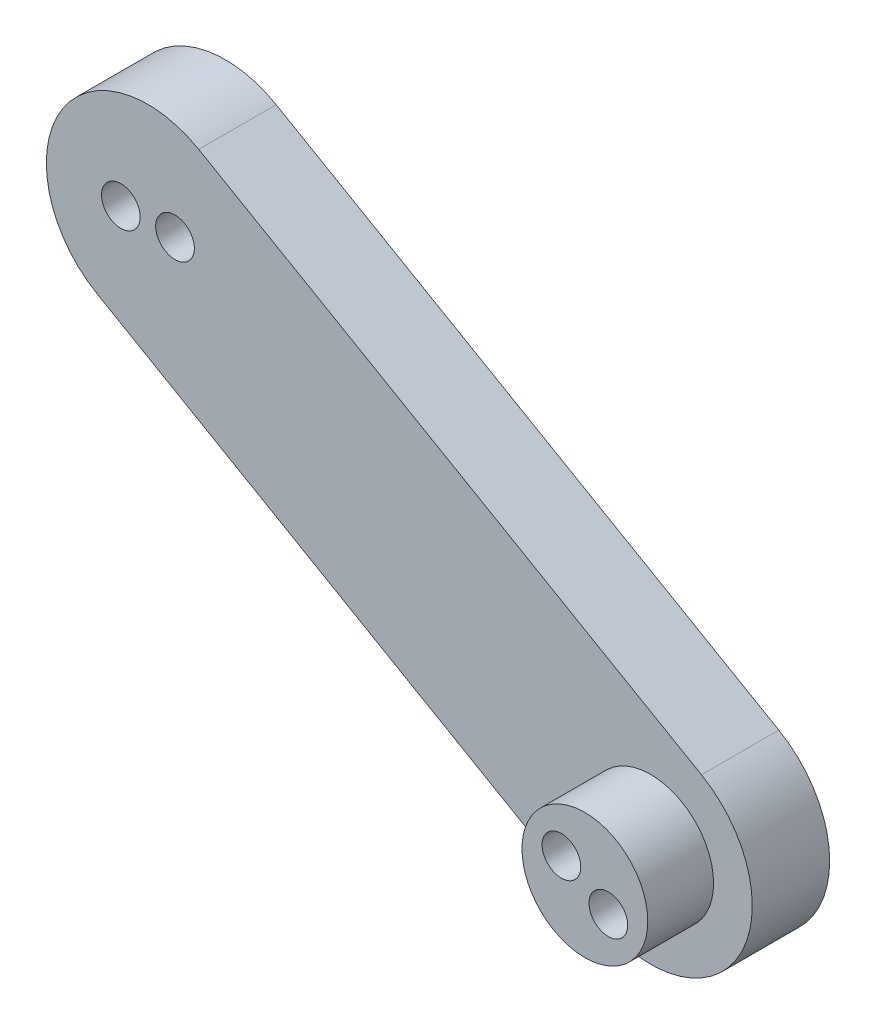
ISO-10303-21;
HEADER;
FILE_DESCRIPTION(('STEP AP214'),'2;1');
FILE_NAME('part.step','',(''),(''),'','','');
FILE_SCHEMA(('AUTOMOTIVE_DESIGN { 1 0 10303 214 1 1 1 1 }'));
ENDSEC;
DATA;
#1=APPLICATION_CONTEXT('core data for automotive mechanical design processes');
#2=APPLICATION_PROTOCOL_DEFINITION('international standard','automotive_design',2000,#1);
#3=PRODUCT_CONTEXT('',#1,'mechanical');
#4=PRODUCT('Part','Part','',(#3));
#5=PRODUCT_RELATED_PRODUCT_CATEGORY('part','',(#4));
#6=PRODUCT_DEFINITION_FORMATION('','',#4);
#7=PRODUCT_DEFINITION_CONTEXT('part definition',#1,'design');
#8=PRODUCT_DEFINITION('design','',#6,#7);
#9=PRODUCT_DEFINITION_SHAPE('','',#8);
#10=(LENGTH_UNIT() NAMED_UNIT(*) SI_UNIT(.MILLI.,.METRE.));
#11=(NAMED_UNIT(*) PLANE_ANGLE_UNIT() SI_UNIT($,.RADIAN.));
#12=(NAMED_UNIT(*) SI_UNIT($,.STERADIAN.) SOLID_ANGLE_UNIT());
#13=UNCERTAINTY_MEASURE_WITH_UNIT(LENGTH_MEASURE(1.E-05),#10,'distance_accuracy_value','');
#14=(GEOMETRIC_REPRESENTATION_CONTEXT(3) GLOBAL_UNCERTAINTY_ASSIGNED_CONTEXT((#13)) GLOBAL_UNIT_ASSIGNED_CONTEXT((#10,
#11,#12)) REPRESENTATION_CONTEXT('',''));
#15=CARTESIAN_POINT('',(0.,0.,0.));
#16=DIRECTION('',(0.,0.,1.));
#17=DIRECTION('',(1.,0.,0.));
#18=AXIS2_PLACEMENT_3D('',#15,#16,#17);
#19=CARTESIAN_POINT('',(-2.62499999999997,-4.54663336986832,-4.));
#20=DIRECTION('',(0.499999999999995,0.866025403784442,0.));
#21=DIRECTION('',(-0.866025403784442,0.499999999999995,0.));
#22=AXIS2_PLACEMENT_3D('',#19,#20,#21);
#23=PLANE('',#22);
#24=DIRECTION('',(-0.866025403784442,0.499999999999995,0.));
#25=VECTOR('',#24,1.);
#26=CARTESIAN_POINT('',(-2.62499999999997,-4.54663336986832,0.));
#27=LINE('',#26,#25);
#28=CARTESIAN_POINT('',(23.3557621135333,-19.5466333698682,0.));
#29=VERTEX_POINT('',#28);
#30=CARTESIAN_POINT('',(-2.62499999999997,-4.54663336986832,0.));
#31=VERTEX_POINT('',#30);
#32=EDGE_CURVE('E124',#29,#31,#27,.T.);
#33=ORIENTED_EDGE('',*,*,#32,.T.);
#34=DIRECTION('',(0.,0.,1.));
#35=VECTOR('',#34,1.);
#36=CARTESIAN_POINT('',(-2.62499999999997,-4.54663336986832,-4.));
#37=LINE('',#36,#35);
#38=CARTESIAN_POINT('',(-2.62499999999997,-4.54663336986832,-4.));
#39=VERTEX_POINT('',#38);
#40=EDGE_CURVE('E11',#39,#31,#37,.T.);
#41=ORIENTED_EDGE('',*,*,#40,.F.);
#42=DIRECTION('',(-0.866025403784442,0.499999999999995,0.));
#43=VECTOR('',#42,1.);
#44=CARTESIAN_POINT('',(-2.62499999999997,-4.54663336986832,-4.));
#45=LINE('',#44,#43);
#46=CARTESIAN_POINT('',(23.3557621135333,-19.5466333698682,-4.));
#47=VERTEX_POINT('',#46);
#48=EDGE_CURVE('E64',#47,#39,#45,.T.);
#49=ORIENTED_EDGE('',*,*,#48,.F.);
#50=DIRECTION('',(0.,0.,1.));
#51=VECTOR('',#50,1.);
#52=CARTESIAN_POINT('',(23.3557621135333,-19.5466333698682,-4.));
#53=LINE('',#52,#51);
#54=EDGE_CURVE('E49',#47,#29,#53,.T.);
#55=ORIENTED_EDGE('',*,*,#54,.T.);
#56=EDGE_LOOP('',(#33,#41,#49,#55));
#57=FACE_BOUND('',#56,.T.);
#58=ADVANCED_FACE('F45',(#57),#23,.F.);
#59=CARTESIAN_POINT('',(0.,0.,-4.));
#60=DIRECTION('',(0.,0.,1.));
#61=DIRECTION('',(1.,0.,0.));
#62=AXIS2_PLACEMENT_3D('',#59,#60,#61);
#63=CYLINDRICAL_SURFACE('',#62,5.25);
#64=CARTESIAN_POINT('',(0.,0.,0.));
#65=DIRECTION('',(0.,0.,1.));
#66=DIRECTION('',(1.,0.,0.));
#67=AXIS2_PLACEMENT_3D('',#64,#65,#66);
#68=CIRCLE('',#67,5.25);
#69=CARTESIAN_POINT('',(2.62499999999997,4.54663336986832,0.));
#70=VERTEX_POINT('',#69);
#71=EDGE_CURVE('E129',#70,#31,#68,.T.);
#72=ORIENTED_EDGE('',*,*,#71,.F.);
#73=DIRECTION('',(0.,0.,1.));
#74=VECTOR('',#73,1.);
#75=CARTESIAN_POINT('',(2.62499999999997,4.54663336986832,-4.));
#76=LINE('',#75,#74);
#77=CARTESIAN_POINT('',(2.62499999999997,4.54663336986832,-4.));
#78=VERTEX_POINT('',#77);
#79=EDGE_CURVE('E55',#78,#70,#76,.T.);
#80=ORIENTED_EDGE('',*,*,#79,.F.);
#81=CARTESIAN_POINT('',(0.,0.,-4.));
#82=DIRECTION('',(0.,0.,1.));
#83=DIRECTION('',(1.,0.,0.));
#84=AXIS2_PLACEMENT_3D('',#81,#82,#83);
#85=CIRCLE('',#84,5.25);
#86=EDGE_CURVE('E98',#78,#39,#85,.T.);
#87=ORIENTED_EDGE('',*,*,#86,.T.);
#88=ORIENTED_EDGE('',*,*,#40,.T.);
#89=EDGE_LOOP('',(#72,#80,#87,#88));
#90=FACE_BOUND('',#89,.T.);
#91=ADVANCED_FACE('F177',(#90),#63,.T.);
#92=CARTESIAN_POINT('',(2.62499999999997,4.54663336986832,-4.));
#93=DIRECTION('',(-0.499999999999995,-0.866025403784442,0.));
#94=DIRECTION('',(0.866025403784442,-0.499999999999995,0.));
#95=AXIS2_PLACEMENT_3D('',#92,#93,#94);
#96=PLANE('',#95);
#97=DIRECTION('',(0.866025403784442,-0.499999999999995,0.));
#98=VECTOR('',#97,1.);
#99=CARTESIAN_POINT('',(2.62499999999997,4.54663336986832,0.));
#100=LINE('',#99,#98);
#101=CARTESIAN_POINT('',(28.6057621135332,-10.4533666301315,0.));
#102=VERTEX_POINT('',#101);
#103=EDGE_CURVE('E102',#70,#102,#100,.T.);
#104=ORIENTED_EDGE('',*,*,#103,.T.);
#105=DIRECTION('',(0.,0.,1.));
#106=VECTOR('',#105,1.);
#107=CARTESIAN_POINT('',(28.6057621135332,-10.4533666301315,-4.));
#108=LINE('',#107,#106);
#109=CARTESIAN_POINT('',(28.6057621135332,-10.4533666301315,-4.));
#110=VERTEX_POINT('',#109);
#111=EDGE_CURVE('E100',#110,#102,#108,.T.);
#112=ORIENTED_EDGE('',*,*,#111,.F.);
#113=DIRECTION('',(0.866025403784442,-0.499999999999995,0.));
#114=VECTOR('',#113,1.);
#115=CARTESIAN_POINT('',(2.62499999999997,4.54663336986832,-4.));
#116=LINE('',#115,#114);
#117=EDGE_CURVE('E93',#78,#110,#116,.T.);
#118=ORIENTED_EDGE('',*,*,#117,.F.);
#119=ORIENTED_EDGE('',*,*,#79,.T.);
#120=EDGE_LOOP('',(#104,#112,#118,#119));
#121=FACE_BOUND('',#120,.T.);
#122=ADVANCED_FACE('F101',(#121),#96,.F.);
#123=CARTESIAN_POINT('',(24.768326548235,-14.2999999999998,-4.));
#124=DIRECTION('',(0.,0.,1.));
#125=DIRECTION('',(1.,0.,0.));
#126=AXIS2_PLACEMENT_3D('',#123,#124,#125);
#127=CYLINDRICAL_SURFACE('',#126,0.999999999999992);
#128=CARTESIAN_POINT('',(24.768326548235,-14.2999999999998,-4.));
#129=DIRECTION('',(0.,0.,1.));
#130=DIRECTION('',(1.,0.,0.));
#131=AXIS2_PLACEMENT_3D('',#128,#129,#130);
#132=CIRCLE('',#131,0.999999999999992);
#133=CARTESIAN_POINT('',(25.768326548235,-14.2999999999998,-4.));
#134=VERTEX_POINT('',#133);
#135=EDGE_CURVE('E111',#134,#134,#132,.T.);
#136=ORIENTED_EDGE('',*,*,#135,.F.);
#137=EDGE_LOOP('',(#136));
#138=FACE_BOUND('',#137,.T.);
#139=CARTESIAN_POINT('',(24.768326548235,-14.2999999999998,3.4));
#140=DIRECTION('',(0.,0.,1.));
#141=DIRECTION('',(1.,0.,0.));
#142=AXIS2_PLACEMENT_3D('',#139,#140,#141);
#143=CIRCLE('',#142,0.999999999999992);
#144=CARTESIAN_POINT('',(25.768326548235,-14.2999999999998,3.4));
#145=VERTEX_POINT('',#144);
#146=EDGE_CURVE('E144',#145,#145,#143,.T.);
#147=ORIENTED_EDGE('',*,*,#146,.T.);
#148=EDGE_LOOP('',(#147));
#149=FACE_BOUND('',#148,.T.);
#150=ADVANCED_FACE('F153',(#138,#149),#127,.F.);
#151=CARTESIAN_POINT('',(25.9807621135332,-14.9999999999998,-4.));
#152=DIRECTION('',(0.,0.,1.));
#153=DIRECTION('',(1.,0.,0.));
#154=AXIS2_PLACEMENT_3D('',#151,#152,#153);
#155=CYLINDRICAL_SURFACE('',#154,5.25);
#156=CARTESIAN_POINT('',(25.9807621135332,-14.9999999999998,0.));
#157=DIRECTION('',(0.,0.,1.));
#158=DIRECTION('',(1.,0.,0.));
#159=AXIS2_PLACEMENT_3D('',#156,#157,#158);
#160=CIRCLE('',#159,5.25);
#161=EDGE_CURVE('E126',#29,#102,#160,.T.);
#162=ORIENTED_EDGE('',*,*,#161,.F.);
#163=ORIENTED_EDGE('',*,*,#54,.F.);
#164=CARTESIAN_POINT('',(25.9807621135332,-14.9999999999998,-4.));
#165=DIRECTION('',(0.,0.,1.));
#166=DIRECTION('',(1.,0.,0.));
#167=AXIS2_PLACEMENT_3D('',#164,#165,#166);
#168=CIRCLE('',#167,5.25);
#169=EDGE_CURVE('E97',#47,#110,#168,.T.);
#170=ORIENTED_EDGE('',*,*,#169,.T.);
#171=ORIENTED_EDGE('',*,*,#111,.T.);
#172=EDGE_LOOP('',(#162,#163,#170,#171));
#173=FACE_BOUND('',#172,.T.);
#174=ADVANCED_FACE('F104',(#173),#155,.T.);
#175=CARTESIAN_POINT('',(1.40000000000002,0.,-4.));
#176=DIRECTION('',(0.,0.,1.));
#177=DIRECTION('',(1.,0.,0.));
#178=AXIS2_PLACEMENT_3D('',#175,#176,#177);
#179=CYLINDRICAL_SURFACE('',#178,1.);
#180=CARTESIAN_POINT('',(1.40000000000002,0.,-4.));
#181=DIRECTION('',(0.,0.,1.));
#182=DIRECTION('',(1.,0.,0.));
#183=AXIS2_PLACEMENT_3D('',#180,#181,#182);
#184=CIRCLE('',#183,1.);
#185=CARTESIAN_POINT('',(2.40000000000002,0.,-4.));
#186=VERTEX_POINT('',#185);
#187=EDGE_CURVE('E106',#186,#186,#184,.T.);
#188=ORIENTED_EDGE('',*,*,#187,.F.);
#189=EDGE_LOOP('',(#188));
#190=FACE_BOUND('',#189,.T.);
#191=CARTESIAN_POINT('',(1.40000000000002,0.,0.));
#192=DIRECTION('',(0.,0.,1.));
#193=DIRECTION('',(1.,0.,0.));
#194=AXIS2_PLACEMENT_3D('',#191,#192,#193);
#195=CIRCLE('',#194,1.);
#196=CARTESIAN_POINT('',(2.40000000000002,0.,0.));
#197=VERTEX_POINT('',#196);
#198=EDGE_CURVE('E120',#197,#197,#195,.T.);
#199=ORIENTED_EDGE('',*,*,#198,.T.);
#200=EDGE_LOOP('',(#199));
#201=FACE_BOUND('',#200,.T.);
#202=ADVANCED_FACE('F190',(#190,#201),#179,.F.);
#203=CARTESIAN_POINT('',(-1.39999999999996,0.,-4.));
#204=DIRECTION('',(0.,0.,1.));
#205=DIRECTION('',(1.,0.,0.));
#206=AXIS2_PLACEMENT_3D('',#203,#204,#205);
#207=CYLINDRICAL_SURFACE('',#206,1.);
#208=CARTESIAN_POINT('',(-1.39999999999996,0.,-4.));
#209=DIRECTION('',(0.,0.,1.));
#210=DIRECTION('',(1.,0.,0.));
#211=AXIS2_PLACEMENT_3D('',#208,#209,#210);
#212=CIRCLE('',#211,1.);
#213=CARTESIAN_POINT('',(-0.39999999999996,0.,-4.));
#214=VERTEX_POINT('',#213);
#215=EDGE_CURVE('E131',#214,#214,#212,.T.);
#216=ORIENTED_EDGE('',*,*,#215,.F.);
#217=EDGE_LOOP('',(#216));
#218=FACE_BOUND('',#217,.T.);
#219=CARTESIAN_POINT('',(-1.39999999999996,0.,0.));
#220=DIRECTION('',(0.,0.,1.));
#221=DIRECTION('',(1.,0.,0.));
#222=AXIS2_PLACEMENT_3D('',#219,#220,#221);
#223=CIRCLE('',#222,1.);
#224=CARTESIAN_POINT('',(-0.39999999999996,0.,0.));
#225=VERTEX_POINT('',#224);
#226=EDGE_CURVE('E117',#225,#225,#223,.T.);
#227=ORIENTED_EDGE('',*,*,#226,.T.);
#228=EDGE_LOOP('',(#227));
#229=FACE_BOUND('',#228,.T.);
#230=ADVANCED_FACE('F47',(#218,#229),#207,.F.);
#231=CARTESIAN_POINT('',(27.1931976788315,-15.6999999999998,-4.));
#232=DIRECTION('',(0.,0.,1.));
#233=DIRECTION('',(1.,0.,0.));
#234=AXIS2_PLACEMENT_3D('',#231,#232,#233);
#235=CYLINDRICAL_SURFACE('',#234,0.999999999999987);
#236=CARTESIAN_POINT('',(27.1931976788315,-15.6999999999998,-4.));
#237=DIRECTION('',(0.,0.,1.));
#238=DIRECTION('',(1.,0.,0.));
#239=AXIS2_PLACEMENT_3D('',#236,#237,#238);
#240=CIRCLE('',#239,0.999999999999987);
#241=CARTESIAN_POINT('',(28.1931976788315,-15.6999999999998,-4.));
#242=VERTEX_POINT('',#241);
#243=EDGE_CURVE('E114',#242,#242,#240,.T.);
#244=ORIENTED_EDGE('',*,*,#243,.F.);
#245=EDGE_LOOP('',(#244));
#246=FACE_BOUND('',#245,.T.);
#247=CARTESIAN_POINT('',(27.1931976788315,-15.6999999999998,3.4));
#248=DIRECTION('',(0.,0.,1.));
#249=DIRECTION('',(1.,0.,0.));
#250=AXIS2_PLACEMENT_3D('',#247,#248,#249);
#251=CIRCLE('',#250,0.999999999999987);
#252=CARTESIAN_POINT('',(28.1931976788315,-15.6999999999998,3.4));
#253=VERTEX_POINT('',#252);
#254=EDGE_CURVE('E147',#253,#253,#251,.T.);
#255=ORIENTED_EDGE('',*,*,#254,.T.);
#256=EDGE_LOOP('',(#255));
#257=FACE_BOUND('',#256,.T.);
#258=ADVANCED_FACE('F196',(#246,#257),#235,.F.);
#259=CARTESIAN_POINT('',(0.,0.,-4.));
#260=DIRECTION('',(0.,0.,1.));
#261=DIRECTION('',(1.,0.,0.));
#262=AXIS2_PLACEMENT_3D('',#259,#260,#261);
#263=PLANE('',#262);
#264=ORIENTED_EDGE('',*,*,#215,.T.);
#265=EDGE_LOOP('',(#264));
#266=FACE_BOUND('',#265,.T.);
#267=ORIENTED_EDGE('',*,*,#187,.T.);
#268=EDGE_LOOP('',(#267));
#269=FACE_BOUND('',#268,.T.);
#270=ORIENTED_EDGE('',*,*,#48,.T.);
#271=ORIENTED_EDGE('',*,*,#86,.F.);
#272=ORIENTED_EDGE('',*,*,#117,.T.);
#273=ORIENTED_EDGE('',*,*,#169,.F.);
#274=EDGE_LOOP('',(#270,#271,#272,#273));
#275=FACE_BOUND('',#274,.T.);
#276=ORIENTED_EDGE('',*,*,#135,.T.);
#277=EDGE_LOOP('',(#276));
#278=FACE_BOUND('',#277,.T.);
#279=ORIENTED_EDGE('',*,*,#243,.T.);
#280=EDGE_LOOP('',(#279));
#281=FACE_BOUND('',#280,.T.);
#282=ADVANCED_FACE('F95',(#266,#269,#275,#278,#281),#263,.F.);
#283=CARTESIAN_POINT('',(0.,0.,0.));
#284=DIRECTION('',(0.,0.,1.));
#285=DIRECTION('',(1.,0.,0.));
#286=AXIS2_PLACEMENT_3D('',#283,#284,#285);
#287=PLANE('',#286);
#288=CARTESIAN_POINT('',(25.9807621135332,-14.9999999999998,0.));
#289=DIRECTION('',(0.,0.,1.));
#290=DIRECTION('',(1.,0.,0.));
#291=AXIS2_PLACEMENT_3D('',#288,#289,#290);
#292=CIRCLE('',#291,3.25);
#293=CARTESIAN_POINT('',(29.2307621135332,-14.9999999999998,0.));
#294=VERTEX_POINT('',#293);
#295=EDGE_CURVE('E141',#294,#294,#292,.T.);
#296=ORIENTED_EDGE('',*,*,#295,.F.);
#297=EDGE_LOOP('',(#296));
#298=FACE_BOUND('',#297,.T.);
#299=ORIENTED_EDGE('',*,*,#226,.F.);
#300=EDGE_LOOP('',(#299));
#301=FACE_BOUND('',#300,.T.);
#302=ORIENTED_EDGE('',*,*,#198,.F.);
#303=EDGE_LOOP('',(#302));
#304=FACE_BOUND('',#303,.T.);
#305=ORIENTED_EDGE('',*,*,#32,.F.);
#306=ORIENTED_EDGE('',*,*,#161,.T.);
#307=ORIENTED_EDGE('',*,*,#103,.F.);
#308=ORIENTED_EDGE('',*,*,#71,.T.);
#309=EDGE_LOOP('',(#305,#306,#307,#308));
#310=FACE_BOUND('',#309,.T.);
#311=ADVANCED_FACE('F166',(#298,#301,#304,#310),#287,.T.);
#312=CARTESIAN_POINT('',(25.9807621135332,-14.9999999999998,3.4));
#313=DIRECTION('',(0.,0.,-1.));
#314=DIRECTION('',(-1.,0.,0.));
#315=AXIS2_PLACEMENT_3D('',#312,#313,#314);
#316=CYLINDRICAL_SURFACE('',#315,3.25);
#317=CARTESIAN_POINT('',(25.9807621135332,-14.9999999999998,3.4));
#318=DIRECTION('',(0.,0.,1.));
#319=DIRECTION('',(1.,0.,0.));
#320=AXIS2_PLACEMENT_3D('',#317,#318,#319);
#321=CIRCLE('',#320,3.25);
#322=CARTESIAN_POINT('',(29.2307621135332,-14.9999999999998,3.4));
#323=VERTEX_POINT('',#322);
#324=EDGE_CURVE('E121',#323,#323,#321,.T.);
#325=ORIENTED_EDGE('',*,*,#324,.F.);
#326=EDGE_LOOP('',(#325));
#327=FACE_BOUND('',#326,.T.);
#328=ORIENTED_EDGE('',*,*,#295,.T.);
#329=EDGE_LOOP('',(#328));
#330=FACE_BOUND('',#329,.T.);
#331=ADVANCED_FACE('F158',(#327,#330),#316,.T.);
#332=CARTESIAN_POINT('',(0.,0.,3.4));
#333=DIRECTION('',(0.,0.,1.));
#334=DIRECTION('',(1.,0.,0.));
#335=AXIS2_PLACEMENT_3D('',#332,#333,#334);
#336=PLANE('',#335);
#337=ORIENTED_EDGE('',*,*,#146,.F.);
#338=EDGE_LOOP('',(#337));
#339=FACE_BOUND('',#338,.T.);
#340=ORIENTED_EDGE('',*,*,#254,.F.);
#341=EDGE_LOOP('',(#340));
#342=FACE_BOUND('',#341,.T.);
#343=ORIENTED_EDGE('',*,*,#324,.T.);
#344=EDGE_LOOP('',(#343));
#345=FACE_BOUND('',#344,.T.);
#346=ADVANCED_FACE('F155',(#339,#342,#345),#336,.T.);
#347=CLOSED_SHELL('',(#58,#91,#122,#150,#174,#202,#230,#258,#282,#311,#331,#346));
#348=MANIFOLD_SOLID_BREP('B2',#347);
#349=ADVANCED_BREP_SHAPE_REPRESENTATION('',(#18,#348),#14);
#350=SHAPE_DEFINITION_REPRESENTATION(#9,#349);
ENDSEC;
END-ISO-10303-21;
